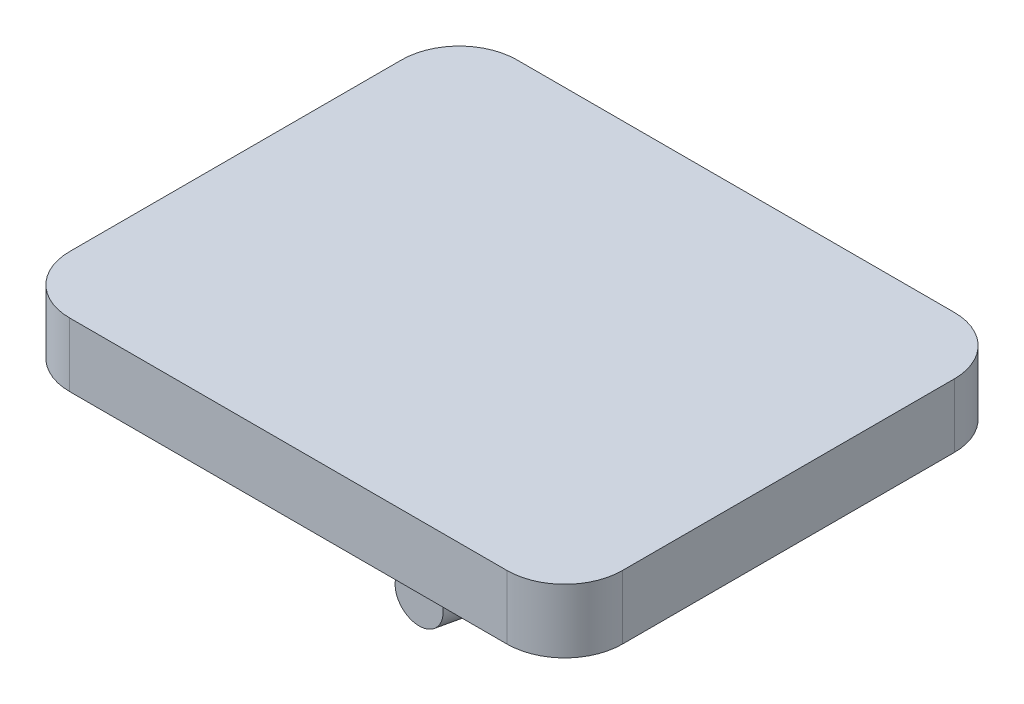
ISO-10303-21;
HEADER;
FILE_DESCRIPTION(('STEP AP214'),'2;1');
FILE_NAME('part.step','',(''),(''),'','','');
FILE_SCHEMA(('AUTOMOTIVE_DESIGN { 1 0 10303 214 1 1 1 1 }'));
ENDSEC;
DATA;
#1=APPLICATION_CONTEXT('core data for automotive mechanical design processes');
#2=APPLICATION_PROTOCOL_DEFINITION('international standard','automotive_design',2000,#1);
#3=PRODUCT_CONTEXT('',#1,'mechanical');
#4=PRODUCT('Part','Part','',(#3));
#5=PRODUCT_RELATED_PRODUCT_CATEGORY('part','',(#4));
#6=PRODUCT_DEFINITION_FORMATION('','',#4);
#7=PRODUCT_DEFINITION_CONTEXT('part definition',#1,'design');
#8=PRODUCT_DEFINITION('design','',#6,#7);
#9=PRODUCT_DEFINITION_SHAPE('','',#8);
#10=(LENGTH_UNIT() NAMED_UNIT(*) SI_UNIT(.MILLI.,.METRE.));
#11=(NAMED_UNIT(*) PLANE_ANGLE_UNIT() SI_UNIT($,.RADIAN.));
#12=(NAMED_UNIT(*) SI_UNIT($,.STERADIAN.) SOLID_ANGLE_UNIT());
#13=UNCERTAINTY_MEASURE_WITH_UNIT(LENGTH_MEASURE(1.E-05),#10,'distance_accuracy_value','');
#14=(GEOMETRIC_REPRESENTATION_CONTEXT(3) GLOBAL_UNCERTAINTY_ASSIGNED_CONTEXT((#13)) GLOBAL_UNIT_ASSIGNED_CONTEXT((#10,
#11,#12)) REPRESENTATION_CONTEXT('',''));
#15=CARTESIAN_POINT('',(0.,0.,0.));
#16=DIRECTION('',(0.,0.,1.));
#17=DIRECTION('',(1.,0.,0.));
#18=AXIS2_PLACEMENT_3D('',#15,#16,#17);
#19=CARTESIAN_POINT('',(0.,0.,0.));
#20=DIRECTION('',(0.,1.,0.));
#21=DIRECTION('',(0.,0.,1.));
#22=AXIS2_PLACEMENT_3D('',#19,#20,#21);
#23=PLANE('',#22);
#24=CARTESIAN_POINT('',(-113.85,0.,86.4));
#25=DIRECTION('',(0.,-1.,0.));
#26=DIRECTION('',(0.,0.,-1.));
#27=AXIS2_PLACEMENT_3D('',#24,#25,#26);
#28=CIRCLE('',#27,2.5);
#29=CARTESIAN_POINT('',(-113.85,0.,83.9));
#30=VERTEX_POINT('',#29);
#31=EDGE_CURVE('E250',#30,#30,#28,.T.);
#32=ORIENTED_EDGE('',*,*,#31,.F.);
#33=EDGE_LOOP('',(#32));
#34=FACE_BOUND('',#33,.T.);
#35=CARTESIAN_POINT('',(0.,0.,86.4));
#36=DIRECTION('',(0.,-1.,0.));
#37=DIRECTION('',(0.,0.,-1.));
#38=AXIS2_PLACEMENT_3D('',#35,#36,#37);
#39=CIRCLE('',#38,2.5);
#40=CARTESIAN_POINT('',(0.,0.,83.9));
#41=VERTEX_POINT('',#40);
#42=EDGE_CURVE('E256',#41,#41,#39,.T.);
#43=ORIENTED_EDGE('',*,*,#42,.F.);
#44=EDGE_LOOP('',(#43));
#45=FACE_BOUND('',#44,.T.);
#46=CARTESIAN_POINT('',(113.85,0.,86.4));
#47=DIRECTION('',(0.,-1.,0.));
#48=DIRECTION('',(0.,0.,-1.));
#49=AXIS2_PLACEMENT_3D('',#46,#47,#48);
#50=CIRCLE('',#49,2.5);
#51=CARTESIAN_POINT('',(113.85,0.,83.9));
#52=VERTEX_POINT('',#51);
#53=EDGE_CURVE('E238',#52,#52,#50,.T.);
#54=ORIENTED_EDGE('',*,*,#53,.F.);
#55=EDGE_LOOP('',(#54));
#56=FACE_BOUND('',#55,.T.);
#57=CARTESIAN_POINT('',(0.,0.,-86.4));
#58=DIRECTION('',(0.,-1.,0.));
#59=DIRECTION('',(0.,0.,-1.));
#60=AXIS2_PLACEMENT_3D('',#57,#58,#59);
#61=CIRCLE('',#60,2.5);
#62=CARTESIAN_POINT('',(0.,0.,-88.9));
#63=VERTEX_POINT('',#62);
#64=EDGE_CURVE('E245',#63,#63,#61,.T.);
#65=ORIENTED_EDGE('',*,*,#64,.F.);
#66=EDGE_LOOP('',(#65));
#67=FACE_BOUND('',#66,.T.);
#68=CARTESIAN_POINT('',(113.85,0.,-86.4));
#69=DIRECTION('',(0.,-1.,0.));
#70=DIRECTION('',(0.,0.,-1.));
#71=AXIS2_PLACEMENT_3D('',#68,#69,#70);
#72=CIRCLE('',#71,2.5);
#73=CARTESIAN_POINT('',(113.85,0.,-88.9));
#74=VERTEX_POINT('',#73);
#75=EDGE_CURVE('E232',#74,#74,#72,.T.);
#76=ORIENTED_EDGE('',*,*,#75,.F.);
#77=EDGE_LOOP('',(#76));
#78=FACE_BOUND('',#77,.T.);
#79=CARTESIAN_POINT('',(-108.35,0.,-70.));
#80=DIRECTION('',(0.,1.,0.));
#81=DIRECTION('',(0.,0.,1.));
#82=AXIS2_PLACEMENT_3D('',#79,#80,#81);
#83=CIRCLE('',#82,32.);
#84=CARTESIAN_POINT('',(-108.35,0.,-38.));
#85=VERTEX_POINT('',#84);
#86=EDGE_CURVE('E11',#85,#85,#83,.F.);
#87=ORIENTED_EDGE('',*,*,#86,.F.);
#88=EDGE_LOOP('',(#87));
#89=FACE_BOUND('',#88,.T.);
#90=DIRECTION('',(0.,0.,-1.));
#91=VECTOR('',#90,1.);
#92=CARTESIAN_POINT('',(-143.85,0.,0.));
#93=LINE('',#92,#91);
#94=CARTESIAN_POINT('',(-143.85,0.,86.4000000000001));
#95=VERTEX_POINT('',#94);
#96=CARTESIAN_POINT('',(-143.85,0.,-86.4));
#97=VERTEX_POINT('',#96);
#98=EDGE_CURVE('E183',#95,#97,#93,.T.);
#99=ORIENTED_EDGE('',*,*,#98,.T.);
#100=CARTESIAN_POINT('',(-113.85,0.,-86.4));
#101=DIRECTION('',(0.,1.,0.));
#102=DIRECTION('',(0.,0.,1.));
#103=AXIS2_PLACEMENT_3D('',#100,#101,#102);
#104=CIRCLE('',#103,30.);
#105=CARTESIAN_POINT('',(-113.85,0.,-116.4));
#106=VERTEX_POINT('',#105);
#107=EDGE_CURVE('E163',#97,#106,#104,.F.);
#108=ORIENTED_EDGE('',*,*,#107,.T.);
#109=DIRECTION('',(1.,0.,0.));
#110=VECTOR('',#109,1.);
#111=CARTESIAN_POINT('',(0.,0.,-116.4));
#112=LINE('',#111,#110);
#113=CARTESIAN_POINT('',(113.85,0.,-116.4));
#114=VERTEX_POINT('',#113);
#115=EDGE_CURVE('E167',#106,#114,#112,.T.);
#116=ORIENTED_EDGE('',*,*,#115,.T.);
#117=CARTESIAN_POINT('',(113.85,0.,-86.4));
#118=DIRECTION('',(0.,1.,0.));
#119=DIRECTION('',(0.,0.,1.));
#120=AXIS2_PLACEMENT_3D('',#117,#118,#119);
#121=CIRCLE('',#120,30.);
#122=CARTESIAN_POINT('',(143.85,0.,-86.4));
#123=VERTEX_POINT('',#122);
#124=EDGE_CURVE('E170',#123,#114,#121,.T.);
#125=ORIENTED_EDGE('',*,*,#124,.F.);
#126=DIRECTION('',(0.,0.,-1.));
#127=VECTOR('',#126,1.);
#128=CARTESIAN_POINT('',(143.85,0.,0.));
#129=LINE('',#128,#127);
#130=CARTESIAN_POINT('',(143.85,0.,86.4));
#131=VERTEX_POINT('',#130);
#132=EDGE_CURVE('E173',#131,#123,#129,.T.);
#133=ORIENTED_EDGE('',*,*,#132,.F.);
#134=CARTESIAN_POINT('',(113.85,0.,86.4));
#135=DIRECTION('',(0.,1.,0.));
#136=DIRECTION('',(0.,0.,1.));
#137=AXIS2_PLACEMENT_3D('',#134,#135,#136);
#138=CIRCLE('',#137,30.);
#139=CARTESIAN_POINT('',(113.85,0.,116.4));
#140=VERTEX_POINT('',#139);
#141=EDGE_CURVE('E175',#131,#140,#138,.F.);
#142=ORIENTED_EDGE('',*,*,#141,.T.);
#143=DIRECTION('',(1.,0.,0.));
#144=VECTOR('',#143,1.);
#145=CARTESIAN_POINT('',(0.,0.,116.4));
#146=LINE('',#145,#144);
#147=CARTESIAN_POINT('',(-113.85,0.,116.4));
#148=VERTEX_POINT('',#147);
#149=EDGE_CURVE('E178',#148,#140,#146,.T.);
#150=ORIENTED_EDGE('',*,*,#149,.F.);
#151=CARTESIAN_POINT('',(-113.85,0.,86.4000000000001));
#152=DIRECTION('',(0.,1.,0.));
#153=DIRECTION('',(0.,0.,1.));
#154=AXIS2_PLACEMENT_3D('',#151,#152,#153);
#155=CIRCLE('',#154,30.);
#156=EDGE_CURVE('E181',#95,#148,#155,.T.);
#157=ORIENTED_EDGE('',*,*,#156,.F.);
#158=EDGE_LOOP('',(#99,#108,#116,#125,#133,#142,#150,#157));
#159=FACE_BOUND('',#158,.T.);
#160=DIRECTION('',(0.,0.,1.));
#161=VECTOR('',#160,1.);
#162=CARTESIAN_POINT('',(34.95,0.,0.));
#163=LINE('',#162,#161);
#164=CARTESIAN_POINT('',(34.95,0.,-83.5116726158042));
#165=VERTEX_POINT('',#164);
#166=CARTESIAN_POINT('',(34.95,0.,0.));
#167=VERTEX_POINT('',#166);
#168=EDGE_CURVE('E208',#165,#167,#163,.T.);
#169=ORIENTED_EDGE('',*,*,#168,.T.);
#170=DIRECTION('',(1.,0.,0.));
#171=VECTOR('',#170,1.);
#172=CARTESIAN_POINT('',(34.95,0.,0.));
#173=LINE('',#172,#171);
#174=CARTESIAN_POINT('',(44.95,0.,0.));
#175=VERTEX_POINT('',#174);
#176=EDGE_CURVE('E186',#167,#175,#173,.T.);
#177=ORIENTED_EDGE('',*,*,#176,.T.);
#178=DIRECTION('',(0.,0.,1.));
#179=VECTOR('',#178,1.);
#180=CARTESIAN_POINT('',(44.95,0.,0.));
#181=LINE('',#180,#179);
#182=CARTESIAN_POINT('',(44.95,0.,-83.5116726158042));
#183=VERTEX_POINT('',#182);
#184=EDGE_CURVE('E131',#183,#175,#181,.T.);
#185=ORIENTED_EDGE('',*,*,#184,.F.);
#186=DIRECTION('',(1.,0.,0.));
#187=VECTOR('',#186,1.);
#188=CARTESIAN_POINT('',(34.95,0.,-83.5116726158042));
#189=LINE('',#188,#187);
#190=EDGE_CURVE('E205',#165,#183,#189,.T.);
#191=ORIENTED_EDGE('',*,*,#190,.F.);
#192=EDGE_LOOP('',(#169,#177,#185,#191));
#193=FACE_BOUND('',#192,.T.);
#194=ADVANCED_FACE('F36',(#34,#45,#56,#67,#78,#89,#159,#193),#23,.F.);
#195=CARTESIAN_POINT('',(-143.85,33.2,0.));
#196=DIRECTION('',(-1.,0.,0.));
#197=DIRECTION('',(0.,0.,1.));
#198=AXIS2_PLACEMENT_3D('',#195,#196,#197);
#199=PLANE('',#198);
#200=ORIENTED_EDGE('',*,*,#98,.F.);
#201=DIRECTION('',(0.,-1.,0.));
#202=VECTOR('',#201,1.);
#203=CARTESIAN_POINT('',(-143.85,33.2,86.4000000000001));
#204=LINE('',#203,#202);
#205=CARTESIAN_POINT('',(-143.85,33.2,86.4000000000001));
#206=VERTEX_POINT('',#205);
#207=EDGE_CURVE('E143',#206,#95,#204,.T.);
#208=ORIENTED_EDGE('',*,*,#207,.F.);
#209=DIRECTION('',(0.,0.,-1.));
#210=VECTOR('',#209,1.);
#211=CARTESIAN_POINT('',(-143.85,33.2,0.));
#212=LINE('',#211,#210);
#213=CARTESIAN_POINT('',(-143.85,33.2,-86.4));
#214=VERTEX_POINT('',#213);
#215=EDGE_CURVE('E166',#206,#214,#212,.T.);
#216=ORIENTED_EDGE('',*,*,#215,.T.);
#217=DIRECTION('',(0.,-1.,0.));
#218=VECTOR('',#217,1.);
#219=CARTESIAN_POINT('',(-143.85,33.2,-86.4));
#220=LINE('',#219,#218);
#221=EDGE_CURVE('E160',#214,#97,#220,.T.);
#222=ORIENTED_EDGE('',*,*,#221,.T.);
#223=EDGE_LOOP('',(#200,#208,#216,#222));
#224=FACE_BOUND('',#223,.T.);
#225=ADVANCED_FACE('F38',(#224),#199,.T.);
#226=CARTESIAN_POINT('',(-113.85,33.2,86.4000000000001));
#227=DIRECTION('',(0.,-1.,0.));
#228=DIRECTION('',(0.,0.,-1.));
#229=AXIS2_PLACEMENT_3D('',#226,#227,#228);
#230=CYLINDRICAL_SURFACE('',#229,30.);
#231=ORIENTED_EDGE('',*,*,#156,.T.);
#232=DIRECTION('',(0.,-1.,0.));
#233=VECTOR('',#232,1.);
#234=CARTESIAN_POINT('',(-113.85,33.2,116.4));
#235=LINE('',#234,#233);
#236=CARTESIAN_POINT('',(-113.85,33.2,116.4));
#237=VERTEX_POINT('',#236);
#238=EDGE_CURVE('E144',#237,#148,#235,.T.);
#239=ORIENTED_EDGE('',*,*,#238,.F.);
#240=CARTESIAN_POINT('',(-113.85,33.2,86.4000000000001));
#241=DIRECTION('',(0.,1.,0.));
#242=DIRECTION('',(0.,0.,1.));
#243=AXIS2_PLACEMENT_3D('',#240,#241,#242);
#244=CIRCLE('',#243,30.);
#245=EDGE_CURVE('E201',#206,#237,#244,.T.);
#246=ORIENTED_EDGE('',*,*,#245,.F.);
#247=ORIENTED_EDGE('',*,*,#207,.T.);
#248=EDGE_LOOP('',(#231,#239,#246,#247));
#249=FACE_BOUND('',#248,.T.);
#250=ADVANCED_FACE('F327',(#249),#230,.T.);
#251=CARTESIAN_POINT('',(0.,33.2,116.4));
#252=DIRECTION('',(0.,0.,-1.));
#253=DIRECTION('',(-1.,0.,0.));
#254=AXIS2_PLACEMENT_3D('',#251,#252,#253);
#255=PLANE('',#254);
#256=ORIENTED_EDGE('',*,*,#149,.T.);
#257=DIRECTION('',(0.,-1.,0.));
#258=VECTOR('',#257,1.);
#259=CARTESIAN_POINT('',(113.85,33.2,116.4));
#260=LINE('',#259,#258);
#261=CARTESIAN_POINT('',(113.85,33.2,116.4));
#262=VERTEX_POINT('',#261);
#263=EDGE_CURVE('E149',#262,#140,#260,.T.);
#264=ORIENTED_EDGE('',*,*,#263,.F.);
#265=DIRECTION('',(1.,0.,0.));
#266=VECTOR('',#265,1.);
#267=CARTESIAN_POINT('',(0.,33.2,116.4));
#268=LINE('',#267,#266);
#269=EDGE_CURVE('E199',#237,#262,#268,.T.);
#270=ORIENTED_EDGE('',*,*,#269,.F.);
#271=ORIENTED_EDGE('',*,*,#238,.T.);
#272=EDGE_LOOP('',(#256,#264,#270,#271));
#273=FACE_BOUND('',#272,.T.);
#274=ADVANCED_FACE('F324',(#273),#255,.F.);
#275=CARTESIAN_POINT('',(113.85,33.2,86.4));
#276=DIRECTION('',(0.,-1.,0.));
#277=DIRECTION('',(0.,0.,-1.));
#278=AXIS2_PLACEMENT_3D('',#275,#276,#277);
#279=CYLINDRICAL_SURFACE('',#278,30.);
#280=ORIENTED_EDGE('',*,*,#141,.F.);
#281=DIRECTION('',(0.,-1.,0.));
#282=VECTOR('',#281,1.);
#283=CARTESIAN_POINT('',(143.85,33.2,86.4));
#284=LINE('',#283,#282);
#285=CARTESIAN_POINT('',(143.85,33.2,86.4));
#286=VERTEX_POINT('',#285);
#287=EDGE_CURVE('E151',#286,#131,#284,.T.);
#288=ORIENTED_EDGE('',*,*,#287,.F.);
#289=CARTESIAN_POINT('',(113.85,33.2,86.4));
#290=DIRECTION('',(0.,1.,0.));
#291=DIRECTION('',(0.,0.,1.));
#292=AXIS2_PLACEMENT_3D('',#289,#290,#291);
#293=CIRCLE('',#292,30.);
#294=EDGE_CURVE('E196',#286,#262,#293,.F.);
#295=ORIENTED_EDGE('',*,*,#294,.T.);
#296=ORIENTED_EDGE('',*,*,#263,.T.);
#297=EDGE_LOOP('',(#280,#288,#295,#296));
#298=FACE_BOUND('',#297,.T.);
#299=ADVANCED_FACE('F320',(#298),#279,.T.);
#300=CARTESIAN_POINT('',(143.85,33.2,0.));
#301=DIRECTION('',(-1.,0.,0.));
#302=DIRECTION('',(0.,0.,1.));
#303=AXIS2_PLACEMENT_3D('',#300,#301,#302);
#304=PLANE('',#303);
#305=ORIENTED_EDGE('',*,*,#132,.T.);
#306=DIRECTION('',(0.,-1.,0.));
#307=VECTOR('',#306,1.);
#308=CARTESIAN_POINT('',(143.85,33.2,-86.4));
#309=LINE('',#308,#307);
#310=CARTESIAN_POINT('',(143.85,33.2,-86.4));
#311=VERTEX_POINT('',#310);
#312=EDGE_CURVE('E153',#311,#123,#309,.T.);
#313=ORIENTED_EDGE('',*,*,#312,.F.);
#314=DIRECTION('',(0.,0.,-1.));
#315=VECTOR('',#314,1.);
#316=CARTESIAN_POINT('',(143.85,33.2,0.));
#317=LINE('',#316,#315);
#318=EDGE_CURVE('E194',#286,#311,#317,.T.);
#319=ORIENTED_EDGE('',*,*,#318,.F.);
#320=ORIENTED_EDGE('',*,*,#287,.T.);
#321=EDGE_LOOP('',(#305,#313,#319,#320));
#322=FACE_BOUND('',#321,.T.);
#323=ADVANCED_FACE('F316',(#322),#304,.F.);
#324=CARTESIAN_POINT('',(113.85,33.2,-86.4));
#325=DIRECTION('',(0.,-1.,0.));
#326=DIRECTION('',(0.,0.,-1.));
#327=AXIS2_PLACEMENT_3D('',#324,#325,#326);
#328=CYLINDRICAL_SURFACE('',#327,30.);
#329=ORIENTED_EDGE('',*,*,#124,.T.);
#330=DIRECTION('',(0.,-1.,0.));
#331=VECTOR('',#330,1.);
#332=CARTESIAN_POINT('',(113.85,33.2,-116.4));
#333=LINE('',#332,#331);
#334=CARTESIAN_POINT('',(113.85,33.2,-116.4));
#335=VERTEX_POINT('',#334);
#336=EDGE_CURVE('E156',#335,#114,#333,.T.);
#337=ORIENTED_EDGE('',*,*,#336,.F.);
#338=CARTESIAN_POINT('',(113.85,33.2,-86.4));
#339=DIRECTION('',(0.,1.,0.));
#340=DIRECTION('',(0.,0.,1.));
#341=AXIS2_PLACEMENT_3D('',#338,#339,#340);
#342=CIRCLE('',#341,30.);
#343=EDGE_CURVE('E192',#311,#335,#342,.T.);
#344=ORIENTED_EDGE('',*,*,#343,.F.);
#345=ORIENTED_EDGE('',*,*,#312,.T.);
#346=EDGE_LOOP('',(#329,#337,#344,#345));
#347=FACE_BOUND('',#346,.T.);
#348=ADVANCED_FACE('F312',(#347),#328,.T.);
#349=CARTESIAN_POINT('',(0.,33.2,-116.4));
#350=DIRECTION('',(0.,0.,-1.));
#351=DIRECTION('',(-1.,0.,0.));
#352=AXIS2_PLACEMENT_3D('',#349,#350,#351);
#353=PLANE('',#352);
#354=ORIENTED_EDGE('',*,*,#115,.F.);
#355=DIRECTION('',(0.,-1.,0.));
#356=VECTOR('',#355,1.);
#357=CARTESIAN_POINT('',(-113.85,33.2,-116.4));
#358=LINE('',#357,#356);
#359=CARTESIAN_POINT('',(-113.85,33.2,-116.4));
#360=VERTEX_POINT('',#359);
#361=EDGE_CURVE('E158',#360,#106,#358,.T.);
#362=ORIENTED_EDGE('',*,*,#361,.F.);
#363=DIRECTION('',(1.,0.,0.));
#364=VECTOR('',#363,1.);
#365=CARTESIAN_POINT('',(0.,33.2,-116.4));
#366=LINE('',#365,#364);
#367=EDGE_CURVE('E189',#360,#335,#366,.T.);
#368=ORIENTED_EDGE('',*,*,#367,.T.);
#369=ORIENTED_EDGE('',*,*,#336,.T.);
#370=EDGE_LOOP('',(#354,#362,#368,#369));
#371=FACE_BOUND('',#370,.T.);
#372=ADVANCED_FACE('F308',(#371),#353,.T.);
#373=CARTESIAN_POINT('',(-113.85,33.2,-86.4));
#374=DIRECTION('',(0.,-1.,0.));
#375=DIRECTION('',(0.,0.,-1.));
#376=AXIS2_PLACEMENT_3D('',#373,#374,#375);
#377=CYLINDRICAL_SURFACE('',#376,30.);
#378=ORIENTED_EDGE('',*,*,#107,.F.);
#379=ORIENTED_EDGE('',*,*,#221,.F.);
#380=CARTESIAN_POINT('',(-113.85,33.2,-86.4));
#381=DIRECTION('',(0.,1.,0.));
#382=DIRECTION('',(0.,0.,1.));
#383=AXIS2_PLACEMENT_3D('',#380,#381,#382);
#384=CIRCLE('',#383,30.);
#385=EDGE_CURVE('E162',#214,#360,#384,.F.);
#386=ORIENTED_EDGE('',*,*,#385,.T.);
#387=ORIENTED_EDGE('',*,*,#361,.T.);
#388=EDGE_LOOP('',(#378,#379,#386,#387));
#389=FACE_BOUND('',#388,.T.);
#390=ADVANCED_FACE('F303',(#389),#377,.T.);
#391=CARTESIAN_POINT('',(0.,33.2,0.));
#392=DIRECTION('',(0.,1.,0.));
#393=DIRECTION('',(0.,0.,1.));
#394=AXIS2_PLACEMENT_3D('',#391,#392,#393);
#395=PLANE('',#394);
#396=ORIENTED_EDGE('',*,*,#215,.F.);
#397=ORIENTED_EDGE('',*,*,#245,.T.);
#398=ORIENTED_EDGE('',*,*,#269,.T.);
#399=ORIENTED_EDGE('',*,*,#294,.F.);
#400=ORIENTED_EDGE('',*,*,#318,.T.);
#401=ORIENTED_EDGE('',*,*,#343,.T.);
#402=ORIENTED_EDGE('',*,*,#367,.F.);
#403=ORIENTED_EDGE('',*,*,#385,.F.);
#404=EDGE_LOOP('',(#396,#397,#398,#399,#400,#401,#402,#403));
#405=FACE_BOUND('',#404,.T.);
#406=ADVANCED_FACE('F298',(#405),#395,.T.);
#407=CARTESIAN_POINT('',(34.95,0.,0.));
#408=DIRECTION('',(0.,0.,1.));
#409=DIRECTION('',(1.,0.,0.));
#410=AXIS2_PLACEMENT_3D('',#407,#408,#409);
#411=PLANE('',#410);
#412=CARTESIAN_POINT('',(39.95,-30.3,0.));
#413=DIRECTION('',(0.,0.,1.));
#414=DIRECTION('',(1.,0.,0.));
#415=AXIS2_PLACEMENT_3D('',#412,#413,#414);
#416=CIRCLE('',#415,25.);
#417=CARTESIAN_POINT('',(44.95,-5.80510257216823,0.));
#418=VERTEX_POINT('',#417);
#419=CARTESIAN_POINT('',(34.95,-5.80510257216822,0.));
#420=VERTEX_POINT('',#419);
#421=EDGE_CURVE('E137',#418,#420,#416,.T.);
#422=ORIENTED_EDGE('',*,*,#421,.F.);
#423=DIRECTION('',(0.,-1.,0.));
#424=VECTOR('',#423,1.);
#425=CARTESIAN_POINT('',(44.95,0.,0.));
#426=LINE('',#425,#424);
#427=EDGE_CURVE('E126',#175,#418,#426,.T.);
#428=ORIENTED_EDGE('',*,*,#427,.F.);
#429=ORIENTED_EDGE('',*,*,#176,.F.);
#430=DIRECTION('',(0.,-1.,0.));
#431=VECTOR('',#430,1.);
#432=CARTESIAN_POINT('',(34.95,0.,0.));
#433=LINE('',#432,#431);
#434=EDGE_CURVE('E139',#167,#420,#433,.T.);
#435=ORIENTED_EDGE('',*,*,#434,.T.);
#436=EDGE_LOOP('',(#422,#428,#429,#435));
#437=FACE_BOUND('',#436,.T.);
#438=ADVANCED_FACE('F138',(#437),#411,.T.);
#439=CARTESIAN_POINT('',(34.95,0.,-83.5116726158042));
#440=DIRECTION('',(0.,0.,-1.));
#441=DIRECTION('',(-1.,0.,0.));
#442=AXIS2_PLACEMENT_3D('',#439,#440,#441);
#443=PLANE('',#442);
#444=CARTESIAN_POINT('',(39.95,-30.3,-83.5116726158042));
#445=DIRECTION('',(0.,0.,-1.));
#446=DIRECTION('',(-1.,0.,0.));
#447=AXIS2_PLACEMENT_3D('',#444,#445,#446);
#448=CIRCLE('',#447,25.);
#449=CARTESIAN_POINT('',(34.95,-5.80510257216822,-83.5116726158042));
#450=VERTEX_POINT('',#449);
#451=CARTESIAN_POINT('',(44.95,-5.80510257216822,-83.5116726158042));
#452=VERTEX_POINT('',#451);
#453=EDGE_CURVE('E51',#450,#452,#448,.T.);
#454=ORIENTED_EDGE('',*,*,#453,.F.);
#455=DIRECTION('',(0.,1.,0.));
#456=VECTOR('',#455,1.);
#457=CARTESIAN_POINT('',(34.95,0.,-83.5116726158042));
#458=LINE('',#457,#456);
#459=EDGE_CURVE('E212',#450,#165,#458,.T.);
#460=ORIENTED_EDGE('',*,*,#459,.T.);
#461=ORIENTED_EDGE('',*,*,#190,.T.);
#462=DIRECTION('',(0.,1.,0.));
#463=VECTOR('',#462,1.);
#464=CARTESIAN_POINT('',(44.95,0.,-83.5116726158042));
#465=LINE('',#464,#463);
#466=EDGE_CURVE('E134',#452,#183,#465,.T.);
#467=ORIENTED_EDGE('',*,*,#466,.F.);
#468=EDGE_LOOP('',(#454,#460,#461,#467));
#469=FACE_BOUND('',#468,.T.);
#470=ADVANCED_FACE('F290',(#469),#443,.T.);
#471=CARTESIAN_POINT('',(34.95,0.,0.));
#472=DIRECTION('',(1.,0.,0.));
#473=DIRECTION('',(0.,0.,-1.));
#474=AXIS2_PLACEMENT_3D('',#471,#472,#473);
#475=PLANE('',#474);
#476=ORIENTED_EDGE('',*,*,#459,.F.);
#477=DIRECTION('',(0.,0.,-1.));
#478=VECTOR('',#477,1.);
#479=CARTESIAN_POINT('',(34.95,-5.80510257216821,-85.6));
#480=LINE('',#479,#478);
#481=EDGE_CURVE('E58',#450,#420,#480,.F.);
#482=ORIENTED_EDGE('',*,*,#481,.T.);
#483=ORIENTED_EDGE('',*,*,#434,.F.);
#484=ORIENTED_EDGE('',*,*,#168,.F.);
#485=EDGE_LOOP('',(#476,#482,#483,#484));
#486=FACE_BOUND('',#485,.T.);
#487=ADVANCED_FACE('F289',(#486),#475,.F.);
#488=CARTESIAN_POINT('',(44.95,0.,0.));
#489=DIRECTION('',(1.,0.,0.));
#490=DIRECTION('',(0.,0.,-1.));
#491=AXIS2_PLACEMENT_3D('',#488,#489,#490);
#492=PLANE('',#491);
#493=DIRECTION('',(0.,0.,-1.));
#494=VECTOR('',#493,1.);
#495=CARTESIAN_POINT('',(44.95,-5.80510257216821,-85.6));
#496=LINE('',#495,#494);
#497=EDGE_CURVE('E44',#452,#418,#496,.F.);
#498=ORIENTED_EDGE('',*,*,#497,.F.);
#499=ORIENTED_EDGE('',*,*,#466,.T.);
#500=ORIENTED_EDGE('',*,*,#184,.T.);
#501=ORIENTED_EDGE('',*,*,#427,.T.);
#502=EDGE_LOOP('',(#498,#499,#500,#501));
#503=FACE_BOUND('',#502,.T.);
#504=ADVANCED_FACE('F128',(#503),#492,.T.);
#505=CARTESIAN_POINT('',(39.95,-30.3,-85.6));
#506=DIRECTION('',(0.,0.,-1.));
#507=DIRECTION('',(0.,1.,0.));
#508=AXIS2_PLACEMENT_3D('',#505,#506,#507);
#509=CYLINDRICAL_SURFACE('',#508,25.);
#510=CARTESIAN_POINT('',(39.95,-30.3,-85.6));
#511=DIRECTION('',(0.,0.,-1.));
#512=DIRECTION('',(0.,1.,0.));
#513=AXIS2_PLACEMENT_3D('',#510,#511,#512);
#514=CIRCLE('',#513,25.);
#515=CARTESIAN_POINT('',(39.95,-5.3,-85.6));
#516=VERTEX_POINT('',#515);
#517=EDGE_CURVE('E222',#516,#516,#514,.T.);
#518=ORIENTED_EDGE('',*,*,#517,.F.);
#519=EDGE_LOOP('',(#518));
#520=FACE_BOUND('',#519,.T.);
#521=CARTESIAN_POINT('',(39.95,-30.3,1.34999999999995));
#522=DIRECTION('',(0.,0.,-1.));
#523=DIRECTION('',(0.,1.,0.));
#524=AXIS2_PLACEMENT_3D('',#521,#522,#523);
#525=CIRCLE('',#524,25.);
#526=CARTESIAN_POINT('',(39.95,-5.30000000000001,1.34999999999995));
#527=VERTEX_POINT('',#526);
#528=EDGE_CURVE('E225',#527,#527,#525,.T.);
#529=ORIENTED_EDGE('',*,*,#528,.T.);
#530=EDGE_LOOP('',(#529));
#531=FACE_BOUND('',#530,.T.);
#532=ORIENTED_EDGE('',*,*,#481,.F.);
#533=ORIENTED_EDGE('',*,*,#453,.T.);
#534=ORIENTED_EDGE('',*,*,#497,.T.);
#535=ORIENTED_EDGE('',*,*,#421,.T.);
#536=EDGE_LOOP('',(#532,#533,#534,#535));
#537=FACE_BOUND('',#536,.T.);
#538=ADVANCED_FACE('F142',(#520,#531,#537),#509,.T.);
#539=CARTESIAN_POINT('',(39.95,-30.3,88.3));
#540=DIRECTION('',(0.,0.,-1.));
#541=DIRECTION('',(0.,1.,0.));
#542=AXIS2_PLACEMENT_3D('',#539,#540,#541);
#543=CONICAL_SURFACE('',#542,12.5,0.142782508771855);
#544=ORIENTED_EDGE('',*,*,#528,.F.);
#545=EDGE_LOOP('',(#544));
#546=FACE_BOUND('',#545,.T.);
#547=CARTESIAN_POINT('',(39.95,-30.3,88.3));
#548=DIRECTION('',(0.,0.,-1.));
#549=DIRECTION('',(0.,1.,0.));
#550=AXIS2_PLACEMENT_3D('',#547,#548,#549);
#551=CIRCLE('',#550,12.5);
#552=CARTESIAN_POINT('',(39.95,-17.8,88.3));
#553=VERTEX_POINT('',#552);
#554=EDGE_CURVE('E219',#553,#553,#551,.T.);
#555=ORIENTED_EDGE('',*,*,#554,.T.);
#556=EDGE_LOOP('',(#555));
#557=FACE_BOUND('',#556,.T.);
#558=ADVANCED_FACE('F473',(#546,#557),#543,.T.);
#559=CARTESIAN_POINT('',(39.95,0.,88.3));
#560=DIRECTION('',(0.,0.,-1.));
#561=DIRECTION('',(0.,1.,0.));
#562=AXIS2_PLACEMENT_3D('',#559,#560,#561);
#563=PLANE('',#562);
#564=ORIENTED_EDGE('',*,*,#554,.F.);
#565=EDGE_LOOP('',(#564));
#566=FACE_BOUND('',#565,.T.);
#567=ADVANCED_FACE('F477',(#566),#563,.F.);
#568=CARTESIAN_POINT('',(39.95,0.,-85.6));
#569=DIRECTION('',(0.,0.,-1.));
#570=DIRECTION('',(0.,1.,0.));
#571=AXIS2_PLACEMENT_3D('',#568,#569,#570);
#572=PLANE('',#571);
#573=ORIENTED_EDGE('',*,*,#517,.T.);
#574=EDGE_LOOP('',(#573));
#575=FACE_BOUND('',#574,.T.);
#576=ADVANCED_FACE('F469',(#575),#572,.T.);
#577=CARTESIAN_POINT('',(-108.35,-5.,-70.));
#578=DIRECTION('',(0.,1.,0.));
#579=DIRECTION('',(0.,0.,1.));
#580=AXIS2_PLACEMENT_3D('',#577,#578,#579);
#581=CYLINDRICAL_SURFACE('',#580,32.);
#582=CARTESIAN_POINT('',(-108.35,-5.,-70.));
#583=DIRECTION('',(0.,-1.,0.));
#584=DIRECTION('',(0.,0.,-1.));
#585=AXIS2_PLACEMENT_3D('',#582,#583,#584);
#586=CIRCLE('',#585,32.);
#587=CARTESIAN_POINT('',(-108.35,-5.,-102.));
#588=VERTEX_POINT('',#587);
#589=EDGE_CURVE('E228',#588,#588,#586,.T.);
#590=ORIENTED_EDGE('',*,*,#589,.F.);
#591=EDGE_LOOP('',(#590));
#592=FACE_BOUND('',#591,.T.);
#593=ORIENTED_EDGE('',*,*,#86,.T.);
#594=EDGE_LOOP('',(#593));
#595=FACE_BOUND('',#594,.T.);
#596=ADVANCED_FACE('F465',(#592,#595),#581,.T.);
#597=CARTESIAN_POINT('',(-108.35,-5.,-70.));
#598=DIRECTION('',(0.,-1.,0.));
#599=DIRECTION('',(0.,0.,-1.));
#600=AXIS2_PLACEMENT_3D('',#597,#598,#599);
#601=PLANE('',#600);
#602=ORIENTED_EDGE('',*,*,#589,.T.);
#603=EDGE_LOOP('',(#602));
#604=FACE_BOUND('',#603,.T.);
#605=ADVANCED_FACE('F366',(#604),#601,.T.);
#606=CARTESIAN_POINT('',(113.85,5.,-86.4));
#607=DIRECTION('',(0.,-1.,0.));
#608=DIRECTION('',(0.,0.,-1.));
#609=AXIS2_PLACEMENT_3D('',#606,#607,#608);
#610=CYLINDRICAL_SURFACE('',#609,2.5);
#611=CARTESIAN_POINT('',(113.85,5.,-86.4));
#612=DIRECTION('',(0.,-1.,0.));
#613=DIRECTION('',(0.,0.,-1.));
#614=AXIS2_PLACEMENT_3D('',#611,#612,#613);
#615=CIRCLE('',#614,2.5);
#616=CARTESIAN_POINT('',(113.85,5.,-88.9));
#617=VERTEX_POINT('',#616);
#618=EDGE_CURVE('E231',#617,#617,#615,.T.);
#619=ORIENTED_EDGE('',*,*,#618,.F.);
#620=EDGE_LOOP('',(#619));
#621=FACE_BOUND('',#620,.T.);
#622=ORIENTED_EDGE('',*,*,#75,.T.);
#623=EDGE_LOOP('',(#622));
#624=FACE_BOUND('',#623,.T.);
#625=ADVANCED_FACE('F371',(#621,#624),#610,.F.);
#626=CARTESIAN_POINT('',(113.85,5.,-86.4));
#627=DIRECTION('',(0.,-1.,0.));
#628=DIRECTION('',(0.,0.,-1.));
#629=AXIS2_PLACEMENT_3D('',#626,#627,#628);
#630=PLANE('',#629);
#631=ORIENTED_EDGE('',*,*,#618,.T.);
#632=EDGE_LOOP('',(#631));
#633=FACE_BOUND('',#632,.T.);
#634=ADVANCED_FACE('F376',(#633),#630,.T.);
#635=CARTESIAN_POINT('',(0.,5.,-86.4));
#636=DIRECTION('',(0.,-1.,0.));
#637=DIRECTION('',(0.,0.,-1.));
#638=AXIS2_PLACEMENT_3D('',#635,#636,#637);
#639=CYLINDRICAL_SURFACE('',#638,2.5);
#640=CARTESIAN_POINT('',(0.,5.,-86.4));
#641=DIRECTION('',(0.,-1.,0.));
#642=DIRECTION('',(0.,0.,-1.));
#643=AXIS2_PLACEMENT_3D('',#640,#641,#642);
#644=CIRCLE('',#643,2.5);
#645=CARTESIAN_POINT('',(0.,5.,-88.9));
#646=VERTEX_POINT('',#645);
#647=EDGE_CURVE('E235',#646,#646,#644,.T.);
#648=ORIENTED_EDGE('',*,*,#647,.F.);
#649=EDGE_LOOP('',(#648));
#650=FACE_BOUND('',#649,.T.);
#651=ORIENTED_EDGE('',*,*,#64,.T.);
#652=EDGE_LOOP('',(#651));
#653=FACE_BOUND('',#652,.T.);
#654=ADVANCED_FACE('F386',(#650,#653),#639,.F.);
#655=CARTESIAN_POINT('',(0.,5.,-86.4));
#656=DIRECTION('',(0.,-1.,0.));
#657=DIRECTION('',(0.,0.,-1.));
#658=AXIS2_PLACEMENT_3D('',#655,#656,#657);
#659=PLANE('',#658);
#660=ORIENTED_EDGE('',*,*,#647,.T.);
#661=EDGE_LOOP('',(#660));
#662=FACE_BOUND('',#661,.T.);
#663=ADVANCED_FACE('F396',(#662),#659,.T.);
#664=CARTESIAN_POINT('',(113.85,5.,86.4));
#665=DIRECTION('',(0.,-1.,0.));
#666=DIRECTION('',(0.,0.,-1.));
#667=AXIS2_PLACEMENT_3D('',#664,#665,#666);
#668=CYLINDRICAL_SURFACE('',#667,2.5);
#669=CARTESIAN_POINT('',(113.85,5.,86.4));
#670=DIRECTION('',(0.,-1.,0.));
#671=DIRECTION('',(0.,0.,-1.));
#672=AXIS2_PLACEMENT_3D('',#669,#670,#671);
#673=CIRCLE('',#672,2.5);
#674=CARTESIAN_POINT('',(113.85,5.,83.9));
#675=VERTEX_POINT('',#674);
#676=EDGE_CURVE('E241',#675,#675,#673,.T.);
#677=ORIENTED_EDGE('',*,*,#676,.F.);
#678=EDGE_LOOP('',(#677));
#679=FACE_BOUND('',#678,.T.);
#680=ORIENTED_EDGE('',*,*,#53,.T.);
#681=EDGE_LOOP('',(#680));
#682=FACE_BOUND('',#681,.T.);
#683=ADVANCED_FACE('F406',(#679,#682),#668,.F.);
#684=CARTESIAN_POINT('',(113.85,5.,86.4));
#685=DIRECTION('',(0.,-1.,0.));
#686=DIRECTION('',(0.,0.,-1.));
#687=AXIS2_PLACEMENT_3D('',#684,#685,#686);
#688=PLANE('',#687);
#689=ORIENTED_EDGE('',*,*,#676,.T.);
#690=EDGE_LOOP('',(#689));
#691=FACE_BOUND('',#690,.T.);
#692=ADVANCED_FACE('F267',(#691),#688,.T.);
#693=CARTESIAN_POINT('',(0.,5.,86.4));
#694=DIRECTION('',(0.,-1.,0.));
#695=DIRECTION('',(0.,0.,-1.));
#696=AXIS2_PLACEMENT_3D('',#693,#694,#695);
#697=CYLINDRICAL_SURFACE('',#696,2.5);
#698=CARTESIAN_POINT('',(0.,5.,86.4));
#699=DIRECTION('',(0.,-1.,0.));
#700=DIRECTION('',(0.,0.,-1.));
#701=AXIS2_PLACEMENT_3D('',#698,#699,#700);
#702=CIRCLE('',#701,2.5);
#703=CARTESIAN_POINT('',(0.,5.,83.9));
#704=VERTEX_POINT('',#703);
#705=EDGE_CURVE('E242',#704,#704,#702,.T.);
#706=ORIENTED_EDGE('',*,*,#705,.F.);
#707=EDGE_LOOP('',(#706));
#708=FACE_BOUND('',#707,.T.);
#709=ORIENTED_EDGE('',*,*,#42,.T.);
#710=EDGE_LOOP('',(#709));
#711=FACE_BOUND('',#710,.T.);
#712=ADVANCED_FACE('F264',(#708,#711),#697,.F.);
#713=CARTESIAN_POINT('',(0.,5.,86.4));
#714=DIRECTION('',(0.,-1.,0.));
#715=DIRECTION('',(0.,0.,-1.));
#716=AXIS2_PLACEMENT_3D('',#713,#714,#715);
#717=PLANE('',#716);
#718=ORIENTED_EDGE('',*,*,#705,.T.);
#719=EDGE_LOOP('',(#718));
#720=FACE_BOUND('',#719,.T.);
#721=ADVANCED_FACE('F262',(#720),#717,.T.);
#722=CARTESIAN_POINT('',(-113.85,5.,86.4));
#723=DIRECTION('',(0.,-1.,0.));
#724=DIRECTION('',(0.,0.,-1.));
#725=AXIS2_PLACEMENT_3D('',#722,#723,#724);
#726=CYLINDRICAL_SURFACE('',#725,2.5);
#727=CARTESIAN_POINT('',(-113.85,5.,86.4));
#728=DIRECTION('',(0.,-1.,0.));
#729=DIRECTION('',(0.,0.,-1.));
#730=AXIS2_PLACEMENT_3D('',#727,#728,#729);
#731=CIRCLE('',#730,2.5);
#732=CARTESIAN_POINT('',(-113.85,5.,83.9));
#733=VERTEX_POINT('',#732);
#734=EDGE_CURVE('E253',#733,#733,#731,.T.);
#735=ORIENTED_EDGE('',*,*,#734,.F.);
#736=EDGE_LOOP('',(#735));
#737=FACE_BOUND('',#736,.T.);
#738=ORIENTED_EDGE('',*,*,#31,.T.);
#739=EDGE_LOOP('',(#738));
#740=FACE_BOUND('',#739,.T.);
#741=ADVANCED_FACE('F440',(#737,#740),#726,.F.);
#742=CARTESIAN_POINT('',(-113.85,5.,86.4));
#743=DIRECTION('',(0.,-1.,0.));
#744=DIRECTION('',(0.,0.,-1.));
#745=AXIS2_PLACEMENT_3D('',#742,#743,#744);
#746=PLANE('',#745);
#747=ORIENTED_EDGE('',*,*,#734,.T.);
#748=EDGE_LOOP('',(#747));
#749=FACE_BOUND('',#748,.T.);
#750=ADVANCED_FACE('F449',(#749),#746,.T.);
#751=CLOSED_SHELL('',(#194,#225,#250,#274,#299,#323,#348,#372,#390,#406,#438,#470,#487,#504,
#538,#558,#567,#576,#596,#605,#625,#634,#654,#663,#683,#692,#712,#721,#741,#750));
#752=MANIFOLD_SOLID_BREP('B2',#751);
#753=ADVANCED_BREP_SHAPE_REPRESENTATION('',(#18,#752),#14);
#754=SHAPE_DEFINITION_REPRESENTATION(#9,#753);
ENDSEC;
END-ISO-10303-21;
